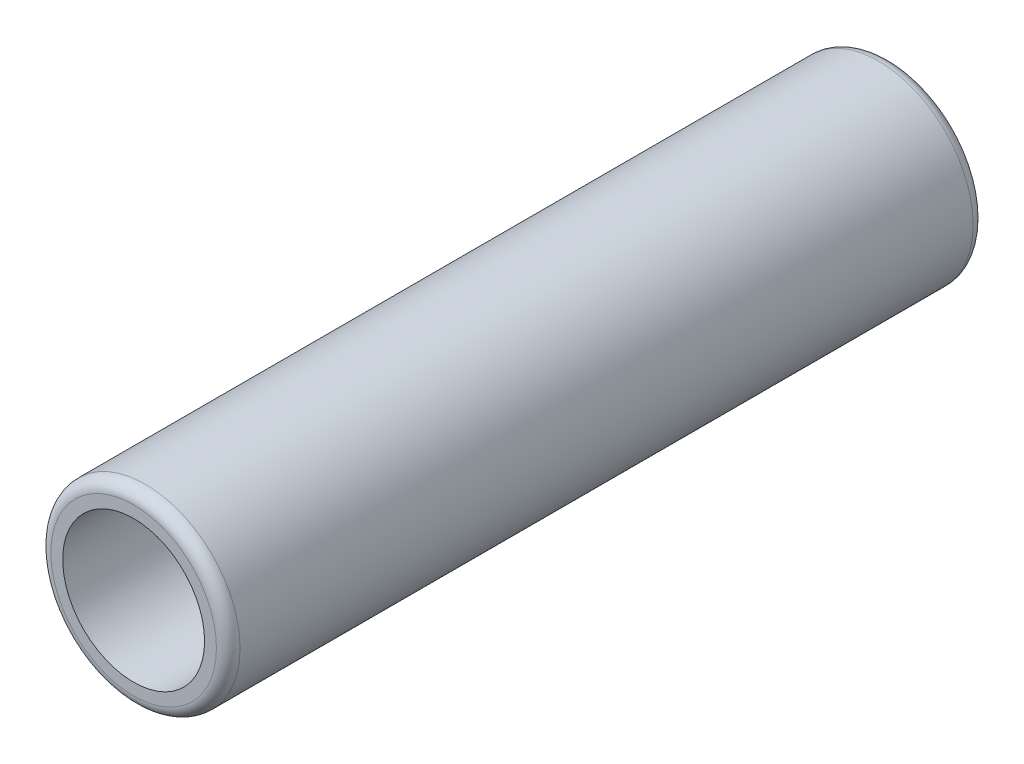
ISO-10303-21;
HEADER;
FILE_DESCRIPTION(('STEP AP214'),'2;1');
FILE_NAME('part.step','',(''),(''),'','','');
FILE_SCHEMA(('AUTOMOTIVE_DESIGN { 1 0 10303 214 1 1 1 1 }'));
ENDSEC;
DATA;
#1=APPLICATION_CONTEXT('core data for automotive mechanical design processes');
#2=APPLICATION_PROTOCOL_DEFINITION('international standard','automotive_design',2000,#1);
#3=PRODUCT_CONTEXT('',#1,'mechanical');
#4=PRODUCT('Part','Part','',(#3));
#5=PRODUCT_RELATED_PRODUCT_CATEGORY('part','',(#4));
#6=PRODUCT_DEFINITION_FORMATION('','',#4);
#7=PRODUCT_DEFINITION_CONTEXT('part definition',#1,'design');
#8=PRODUCT_DEFINITION('design','',#6,#7);
#9=PRODUCT_DEFINITION_SHAPE('','',#8);
#10=(LENGTH_UNIT() NAMED_UNIT(*) SI_UNIT(.MILLI.,.METRE.));
#11=(NAMED_UNIT(*) PLANE_ANGLE_UNIT() SI_UNIT($,.RADIAN.));
#12=(NAMED_UNIT(*) SI_UNIT($,.STERADIAN.) SOLID_ANGLE_UNIT());
#13=UNCERTAINTY_MEASURE_WITH_UNIT(LENGTH_MEASURE(1.E-05),#10,'distance_accuracy_value','');
#14=(GEOMETRIC_REPRESENTATION_CONTEXT(3) GLOBAL_UNCERTAINTY_ASSIGNED_CONTEXT((#13)) GLOBAL_UNIT_ASSIGNED_CONTEXT((#10,
#11,#12)) REPRESENTATION_CONTEXT('',''));
#15=CARTESIAN_POINT('',(0.,0.,0.));
#16=DIRECTION('',(0.,0.,1.));
#17=DIRECTION('',(1.,0.,0.));
#18=AXIS2_PLACEMENT_3D('',#15,#16,#17);
#19=CARTESIAN_POINT('',(0.,0.,32.));
#20=DIRECTION('',(0.,0.,1.));
#21=DIRECTION('',(1.,0.,0.));
#22=AXIS2_PLACEMENT_3D('',#19,#20,#21);
#23=PLANE('',#22);
#24=CARTESIAN_POINT('',(0.,0.,32.));
#25=DIRECTION('',(0.,0.,1.));
#26=DIRECTION('',(1.,0.,0.));
#27=AXIS2_PLACEMENT_3D('',#24,#25,#26);
#28=CIRCLE('',#27,3.5);
#29=CARTESIAN_POINT('',(3.5,0.,32.));
#30=VERTEX_POINT('',#29);
#31=EDGE_CURVE('E10',#30,#30,#28,.T.);
#32=ORIENTED_EDGE('',*,*,#31,.T.);
#33=EDGE_LOOP('',(#32));
#34=FACE_BOUND('',#33,.T.);
#35=CARTESIAN_POINT('',(0.,0.,32.));
#36=DIRECTION('',(0.,0.,1.));
#37=DIRECTION('',(1.,0.,0.));
#38=AXIS2_PLACEMENT_3D('',#35,#36,#37);
#39=CIRCLE('',#38,3.);
#40=CARTESIAN_POINT('',(3.,0.,32.));
#41=VERTEX_POINT('',#40);
#42=EDGE_CURVE('E54',#41,#41,#39,.T.);
#43=ORIENTED_EDGE('',*,*,#42,.F.);
#44=EDGE_LOOP('',(#43));
#45=FACE_BOUND('',#44,.T.);
#46=ADVANCED_FACE('F34',(#34,#45),#23,.T.);
#47=CARTESIAN_POINT('',(0.,0.,0.));
#48=DIRECTION('',(0.,0.,1.));
#49=DIRECTION('',(1.,0.,0.));
#50=AXIS2_PLACEMENT_3D('',#47,#48,#49);
#51=PLANE('',#50);
#52=CARTESIAN_POINT('',(0.,0.,0.));
#53=DIRECTION('',(0.,0.,1.));
#54=DIRECTION('',(1.,0.,0.));
#55=AXIS2_PLACEMENT_3D('',#52,#53,#54);
#56=CIRCLE('',#55,3.5);
#57=CARTESIAN_POINT('',(3.5,0.,0.));
#58=VERTEX_POINT('',#57);
#59=EDGE_CURVE('E41',#58,#58,#56,.F.);
#60=ORIENTED_EDGE('',*,*,#59,.T.);
#61=EDGE_LOOP('',(#60));
#62=FACE_BOUND('',#61,.T.);
#63=CARTESIAN_POINT('',(0.,0.,0.));
#64=DIRECTION('',(0.,0.,1.));
#65=DIRECTION('',(1.,0.,0.));
#66=AXIS2_PLACEMENT_3D('',#63,#64,#65);
#67=CIRCLE('',#66,3.);
#68=CARTESIAN_POINT('',(3.,0.,0.));
#69=VERTEX_POINT('',#68);
#70=EDGE_CURVE('E55',#69,#69,#67,.T.);
#71=ORIENTED_EDGE('',*,*,#70,.T.);
#72=EDGE_LOOP('',(#71));
#73=FACE_BOUND('',#72,.T.);
#74=ADVANCED_FACE('F65',(#62,#73),#51,.F.);
#75=CARTESIAN_POINT('',(0.,0.,32.));
#76=DIRECTION('',(0.,0.,-1.));
#77=DIRECTION('',(-1.,0.,0.));
#78=AXIS2_PLACEMENT_3D('',#75,#76,#77);
#79=CYLINDRICAL_SURFACE('',#78,4.);
#80=CARTESIAN_POINT('',(0.,0.,0.5));
#81=DIRECTION('',(0.,0.,1.));
#82=DIRECTION('',(1.,0.,0.));
#83=AXIS2_PLACEMENT_3D('',#80,#81,#82);
#84=CIRCLE('',#83,4.);
#85=CARTESIAN_POINT('',(4.,0.,0.5));
#86=VERTEX_POINT('',#85);
#87=EDGE_CURVE('E45',#86,#86,#84,.T.);
#88=ORIENTED_EDGE('',*,*,#87,.T.);
#89=EDGE_LOOP('',(#88));
#90=FACE_BOUND('',#89,.T.);
#91=CARTESIAN_POINT('',(0.,0.,31.5));
#92=DIRECTION('',(0.,0.,1.));
#93=DIRECTION('',(1.,0.,0.));
#94=AXIS2_PLACEMENT_3D('',#91,#92,#93);
#95=CIRCLE('',#94,4.);
#96=CARTESIAN_POINT('',(4.,0.,31.5));
#97=VERTEX_POINT('',#96);
#98=EDGE_CURVE('E49',#97,#97,#95,.F.);
#99=ORIENTED_EDGE('',*,*,#98,.T.);
#100=EDGE_LOOP('',(#99));
#101=FACE_BOUND('',#100,.T.);
#102=ADVANCED_FACE('F70',(#90,#101),#79,.T.);
#103=CARTESIAN_POINT('',(0.,0.,32.));
#104=DIRECTION('',(0.,0.,-1.));
#105=DIRECTION('',(-1.,0.,0.));
#106=AXIS2_PLACEMENT_3D('',#103,#104,#105);
#107=CYLINDRICAL_SURFACE('',#106,3.);
#108=ORIENTED_EDGE('',*,*,#42,.T.);
#109=EDGE_LOOP('',(#108));
#110=FACE_BOUND('',#109,.T.);
#111=ORIENTED_EDGE('',*,*,#70,.F.);
#112=EDGE_LOOP('',(#111));
#113=FACE_BOUND('',#112,.T.);
#114=ADVANCED_FACE('F61',(#110,#113),#107,.F.);
#115=CARTESIAN_POINT('',(0.,0.,0.5));
#116=DIRECTION('',(0.,0.,1.));
#117=DIRECTION('',(1.,0.,0.));
#118=AXIS2_PLACEMENT_3D('',#115,#116,#117);
#119=TOROIDAL_SURFACE('',#118,3.5,0.5);
#120=ORIENTED_EDGE('',*,*,#59,.F.);
#121=EDGE_LOOP('',(#120));
#122=FACE_BOUND('',#121,.T.);
#123=ORIENTED_EDGE('',*,*,#87,.F.);
#124=EDGE_LOOP('',(#123));
#125=FACE_BOUND('',#124,.T.);
#126=ADVANCED_FACE('F76',(#122,#125),#119,.T.);
#127=CARTESIAN_POINT('',(0.,0.,31.5));
#128=DIRECTION('',(0.,0.,1.));
#129=DIRECTION('',(1.,0.,0.));
#130=AXIS2_PLACEMENT_3D('',#127,#128,#129);
#131=TOROIDAL_SURFACE('',#130,3.5,0.5);
#132=ORIENTED_EDGE('',*,*,#98,.F.);
#133=EDGE_LOOP('',(#132));
#134=FACE_BOUND('',#133,.T.);
#135=ORIENTED_EDGE('',*,*,#31,.F.);
#136=EDGE_LOOP('',(#135));
#137=FACE_BOUND('',#136,.T.);
#138=ADVANCED_FACE('F36',(#134,#137),#131,.T.);
#139=CLOSED_SHELL('',(#46,#74,#102,#114,#126,#138));
#140=MANIFOLD_SOLID_BREP('B2',#139);
#141=ADVANCED_BREP_SHAPE_REPRESENTATION('',(#18,#140),#14);
#142=SHAPE_DEFINITION_REPRESENTATION(#9,#141);
ENDSEC;
END-ISO-10303-21;
